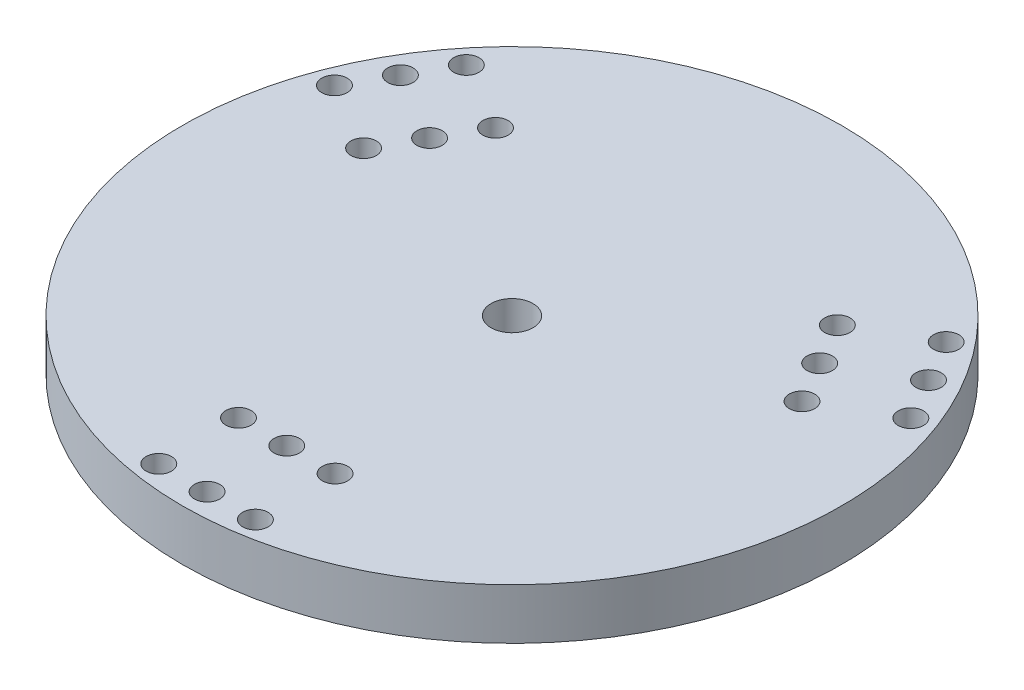
ISO-10303-21;
HEADER;
FILE_DESCRIPTION(('STEP AP214'),'2;1');
FILE_NAME('part.step','',(''),(''),'','','');
FILE_SCHEMA(('AUTOMOTIVE_DESIGN { 1 0 10303 214 1 1 1 1 }'));
ENDSEC;
DATA;
#1=APPLICATION_CONTEXT('core data for automotive mechanical design processes');
#2=APPLICATION_PROTOCOL_DEFINITION('international standard','automotive_design',2000,#1);
#3=PRODUCT_CONTEXT('',#1,'mechanical');
#4=PRODUCT('Part','Part','',(#3));
#5=PRODUCT_RELATED_PRODUCT_CATEGORY('part','',(#4));
#6=PRODUCT_DEFINITION_FORMATION('','',#4);
#7=PRODUCT_DEFINITION_CONTEXT('part definition',#1,'design');
#8=PRODUCT_DEFINITION('design','',#6,#7);
#9=PRODUCT_DEFINITION_SHAPE('','',#8);
#10=(LENGTH_UNIT() NAMED_UNIT(*) SI_UNIT(.MILLI.,.METRE.));
#11=(NAMED_UNIT(*) PLANE_ANGLE_UNIT() SI_UNIT($,.RADIAN.));
#12=(NAMED_UNIT(*) SI_UNIT($,.STERADIAN.) SOLID_ANGLE_UNIT());
#13=UNCERTAINTY_MEASURE_WITH_UNIT(LENGTH_MEASURE(1.E-05),#10,'distance_accuracy_value','');
#14=(GEOMETRIC_REPRESENTATION_CONTEXT(3) GLOBAL_UNCERTAINTY_ASSIGNED_CONTEXT((#13)) GLOBAL_UNIT_ASSIGNED_CONTEXT((#10,
#11,#12)) REPRESENTATION_CONTEXT('',''));
#15=CARTESIAN_POINT('',(0.,0.,0.));
#16=DIRECTION('',(0.,0.,1.));
#17=DIRECTION('',(1.,0.,0.));
#18=AXIS2_PLACEMENT_3D('',#15,#16,#17);
#19=CARTESIAN_POINT('',(0.,65.,0.));
#20=DIRECTION('',(0.,1.,0.));
#21=DIRECTION('',(0.,0.,1.));
#22=AXIS2_PLACEMENT_3D('',#19,#20,#21);
#23=CYLINDRICAL_SURFACE('',#22,64.85);
#24=CARTESIAN_POINT('',(0.,65.,0.));
#25=DIRECTION('',(0.,1.,0.));
#26=DIRECTION('',(0.,0.,1.));
#27=AXIS2_PLACEMENT_3D('',#24,#25,#26);
#28=CIRCLE('',#27,64.85);
#29=CARTESIAN_POINT('',(0.,65.,64.85));
#30=VERTEX_POINT('',#29);
#31=EDGE_CURVE('E50',#30,#30,#28,.F.);
#32=ORIENTED_EDGE('',*,*,#31,.F.);
#33=EDGE_LOOP('',(#32));
#34=FACE_BOUND('',#33,.T.);
#35=CARTESIAN_POINT('',(0.,75.,0.));
#36=DIRECTION('',(0.,1.,0.));
#37=DIRECTION('',(0.,0.,1.));
#38=AXIS2_PLACEMENT_3D('',#35,#36,#37);
#39=CIRCLE('',#38,64.85);
#40=CARTESIAN_POINT('',(0.,75.,64.85));
#41=VERTEX_POINT('',#40);
#42=EDGE_CURVE('E131',#41,#41,#39,.F.);
#43=ORIENTED_EDGE('',*,*,#42,.T.);
#44=EDGE_LOOP('',(#43));
#45=FACE_BOUND('',#44,.T.);
#46=ADVANCED_FACE('F41',(#34,#45),#23,.T.);
#47=CARTESIAN_POINT('',(-33.6322458957263,65.,-30.3872413359521));
#48=DIRECTION('',(0.,1.,0.));
#49=DIRECTION('',(0.,0.,1.));
#50=AXIS2_PLACEMENT_3D('',#47,#48,#49);
#51=CYLINDRICAL_SURFACE('',#50,2.5);
#52=CARTESIAN_POINT('',(-33.6322458957263,65.,-30.3872413359521));
#53=DIRECTION('',(0.,1.,0.));
#54=DIRECTION('',(0.,0.,1.));
#55=AXIS2_PLACEMENT_3D('',#52,#53,#54);
#56=CIRCLE('',#55,2.5);
#57=CARTESIAN_POINT('',(-33.6322458957263,65.,-27.8872413359521));
#58=VERTEX_POINT('',#57);
#59=EDGE_CURVE('E56',#58,#58,#56,.F.);
#60=ORIENTED_EDGE('',*,*,#59,.T.);
#61=EDGE_LOOP('',(#60));
#62=FACE_BOUND('',#61,.T.);
#63=CARTESIAN_POINT('',(-33.6322458957263,75.,-30.3872413359521));
#64=DIRECTION('',(0.,1.,0.));
#65=DIRECTION('',(0.,0.,1.));
#66=AXIS2_PLACEMENT_3D('',#63,#64,#65);
#67=CIRCLE('',#66,2.5);
#68=CARTESIAN_POINT('',(-33.6322458957263,75.,-27.8872413359521));
#69=VERTEX_POINT('',#68);
#70=EDGE_CURVE('E128',#69,#69,#67,.F.);
#71=ORIENTED_EDGE('',*,*,#70,.F.);
#72=EDGE_LOOP('',(#71));
#73=FACE_BOUND('',#72,.T.);
#74=ADVANCED_FACE('F214',(#62,#73),#51,.F.);
#75=CARTESIAN_POINT('',(-47.2115242270664,65.,-38.2272413359521));
#76=DIRECTION('',(0.,1.,0.));
#77=DIRECTION('',(0.,0.,1.));
#78=AXIS2_PLACEMENT_3D('',#75,#76,#77);
#79=CYLINDRICAL_SURFACE('',#78,2.5);
#80=CARTESIAN_POINT('',(-47.2115242270664,65.,-38.2272413359521));
#81=DIRECTION('',(0.,1.,0.));
#82=DIRECTION('',(0.,0.,1.));
#83=AXIS2_PLACEMENT_3D('',#80,#81,#82);
#84=CIRCLE('',#83,2.5);
#85=CARTESIAN_POINT('',(-47.2115242270664,65.,-35.7272413359521));
#86=VERTEX_POINT('',#85);
#87=EDGE_CURVE('E207',#86,#86,#84,.F.);
#88=ORIENTED_EDGE('',*,*,#87,.T.);
#89=EDGE_LOOP('',(#88));
#90=FACE_BOUND('',#89,.T.);
#91=CARTESIAN_POINT('',(-47.2115242270664,75.,-38.2272413359521));
#92=DIRECTION('',(0.,1.,0.));
#93=DIRECTION('',(0.,0.,1.));
#94=AXIS2_PLACEMENT_3D('',#91,#92,#93);
#95=CIRCLE('',#94,2.5);
#96=CARTESIAN_POINT('',(-47.2115242270664,75.,-35.7272413359521));
#97=VERTEX_POINT('',#96);
#98=EDGE_CURVE('E124',#97,#97,#95,.F.);
#99=ORIENTED_EDGE('',*,*,#98,.F.);
#100=EDGE_LOOP('',(#99));
#101=FACE_BOUND('',#100,.T.);
#102=ADVANCED_FACE('F232',(#90,#101),#79,.F.);
#103=CARTESIAN_POINT('',(-9.49999999999995,65.,44.32));
#104=DIRECTION('',(0.,1.,0.));
#105=DIRECTION('',(0.,0.,1.));
#106=AXIS2_PLACEMENT_3D('',#103,#104,#105);
#107=CYLINDRICAL_SURFACE('',#106,2.5);
#108=CARTESIAN_POINT('',(-9.49999999999995,65.,44.32));
#109=DIRECTION('',(0.,1.,0.));
#110=DIRECTION('',(0.,0.,1.));
#111=AXIS2_PLACEMENT_3D('',#108,#109,#110);
#112=CIRCLE('',#111,2.5);
#113=CARTESIAN_POINT('',(-9.49999999999995,65.,46.82));
#114=VERTEX_POINT('',#113);
#115=EDGE_CURVE('E203',#114,#114,#112,.F.);
#116=ORIENTED_EDGE('',*,*,#115,.T.);
#117=EDGE_LOOP('',(#116));
#118=FACE_BOUND('',#117,.T.);
#119=CARTESIAN_POINT('',(-9.49999999999995,75.,44.32));
#120=DIRECTION('',(0.,1.,0.));
#121=DIRECTION('',(0.,0.,1.));
#122=AXIS2_PLACEMENT_3D('',#119,#120,#121);
#123=CIRCLE('',#122,2.5);
#124=CARTESIAN_POINT('',(-9.49999999999995,75.,46.82));
#125=VERTEX_POINT('',#124);
#126=EDGE_CURVE('E120',#125,#125,#123,.F.);
#127=ORIENTED_EDGE('',*,*,#126,.F.);
#128=EDGE_LOOP('',(#127));
#129=FACE_BOUND('',#128,.T.);
#130=ADVANCED_FACE('F239',(#118,#129),#107,.F.);
#131=CARTESIAN_POINT('',(-9.49999999999995,65.,60.));
#132=DIRECTION('',(0.,1.,0.));
#133=DIRECTION('',(0.,0.,1.));
#134=AXIS2_PLACEMENT_3D('',#131,#132,#133);
#135=CYLINDRICAL_SURFACE('',#134,2.5);
#136=CARTESIAN_POINT('',(-9.49999999999995,65.,60.));
#137=DIRECTION('',(0.,1.,0.));
#138=DIRECTION('',(0.,0.,1.));
#139=AXIS2_PLACEMENT_3D('',#136,#137,#138);
#140=CIRCLE('',#139,2.5);
#141=CARTESIAN_POINT('',(-9.49999999999995,65.,62.5));
#142=VERTEX_POINT('',#141);
#143=EDGE_CURVE('E199',#142,#142,#140,.F.);
#144=ORIENTED_EDGE('',*,*,#143,.T.);
#145=EDGE_LOOP('',(#144));
#146=FACE_BOUND('',#145,.T.);
#147=CARTESIAN_POINT('',(-9.49999999999995,75.,60.));
#148=DIRECTION('',(0.,1.,0.));
#149=DIRECTION('',(0.,0.,1.));
#150=AXIS2_PLACEMENT_3D('',#147,#148,#149);
#151=CIRCLE('',#150,2.5);
#152=CARTESIAN_POINT('',(-9.49999999999995,75.,62.5));
#153=VERTEX_POINT('',#152);
#154=EDGE_CURVE('E116',#153,#153,#151,.F.);
#155=ORIENTED_EDGE('',*,*,#154,.F.);
#156=EDGE_LOOP('',(#155));
#157=FACE_BOUND('',#156,.T.);
#158=ADVANCED_FACE('F243',(#146,#157),#135,.F.);
#159=CARTESIAN_POINT('',(43.1322458957263,65.,-13.9327586640478));
#160=DIRECTION('',(0.,1.,0.));
#161=DIRECTION('',(0.,0.,1.));
#162=AXIS2_PLACEMENT_3D('',#159,#160,#161);
#163=CYLINDRICAL_SURFACE('',#162,2.49999999999999);
#164=CARTESIAN_POINT('',(43.1322458957263,65.,-13.9327586640478));
#165=DIRECTION('',(0.,1.,0.));
#166=DIRECTION('',(0.,0.,1.));
#167=AXIS2_PLACEMENT_3D('',#164,#165,#166);
#168=CIRCLE('',#167,2.49999999999999);
#169=CARTESIAN_POINT('',(43.1322458957263,65.,-11.4327586640478));
#170=VERTEX_POINT('',#169);
#171=EDGE_CURVE('E195',#170,#170,#168,.F.);
#172=ORIENTED_EDGE('',*,*,#171,.T.);
#173=EDGE_LOOP('',(#172));
#174=FACE_BOUND('',#173,.T.);
#175=CARTESIAN_POINT('',(43.1322458957263,75.,-13.9327586640478));
#176=DIRECTION('',(0.,1.,0.));
#177=DIRECTION('',(0.,0.,1.));
#178=AXIS2_PLACEMENT_3D('',#175,#176,#177);
#179=CIRCLE('',#178,2.49999999999999);
#180=CARTESIAN_POINT('',(43.1322458957263,75.,-11.4327586640478));
#181=VERTEX_POINT('',#180);
#182=EDGE_CURVE('E112',#181,#181,#179,.F.);
#183=ORIENTED_EDGE('',*,*,#182,.F.);
#184=EDGE_LOOP('',(#183));
#185=FACE_BOUND('',#184,.T.);
#186=ADVANCED_FACE('F247',(#174,#185),#163,.F.);
#187=CARTESIAN_POINT('',(56.7115242270663,65.,-21.7727586640479));
#188=DIRECTION('',(0.,1.,0.));
#189=DIRECTION('',(0.,0.,1.));
#190=AXIS2_PLACEMENT_3D('',#187,#188,#189);
#191=CYLINDRICAL_SURFACE('',#190,2.5);
#192=CARTESIAN_POINT('',(56.7115242270663,65.,-21.7727586640479));
#193=DIRECTION('',(0.,1.,0.));
#194=DIRECTION('',(0.,0.,1.));
#195=AXIS2_PLACEMENT_3D('',#192,#193,#194);
#196=CIRCLE('',#195,2.5);
#197=CARTESIAN_POINT('',(56.7115242270663,65.,-19.2727586640479));
#198=VERTEX_POINT('',#197);
#199=EDGE_CURVE('E191',#198,#198,#196,.F.);
#200=ORIENTED_EDGE('',*,*,#199,.T.);
#201=EDGE_LOOP('',(#200));
#202=FACE_BOUND('',#201,.T.);
#203=CARTESIAN_POINT('',(56.7115242270663,75.,-21.7727586640479));
#204=DIRECTION('',(0.,1.,0.));
#205=DIRECTION('',(0.,0.,1.));
#206=AXIS2_PLACEMENT_3D('',#203,#204,#205);
#207=CIRCLE('',#206,2.5);
#208=CARTESIAN_POINT('',(56.7115242270663,75.,-19.2727586640479));
#209=VERTEX_POINT('',#208);
#210=EDGE_CURVE('E108',#209,#209,#207,.F.);
#211=ORIENTED_EDGE('',*,*,#210,.F.);
#212=EDGE_LOOP('',(#211));
#213=FACE_BOUND('',#212,.T.);
#214=ADVANCED_FACE('F251',(#202,#213),#191,.F.);
#215=CARTESIAN_POINT('',(-43.1322458957264,65.,-13.9327586640478));
#216=DIRECTION('',(0.,1.,0.));
#217=DIRECTION('',(0.,0.,1.));
#218=AXIS2_PLACEMENT_3D('',#215,#216,#217);
#219=CYLINDRICAL_SURFACE('',#218,2.5);
#220=CARTESIAN_POINT('',(-43.1322458957264,65.,-13.9327586640478));
#221=DIRECTION('',(0.,1.,0.));
#222=DIRECTION('',(0.,0.,1.));
#223=AXIS2_PLACEMENT_3D('',#220,#221,#222);
#224=CIRCLE('',#223,2.5);
#225=CARTESIAN_POINT('',(-43.1322458957264,65.,-11.4327586640478));
#226=VERTEX_POINT('',#225);
#227=EDGE_CURVE('E187',#226,#226,#224,.F.);
#228=ORIENTED_EDGE('',*,*,#227,.T.);
#229=EDGE_LOOP('',(#228));
#230=FACE_BOUND('',#229,.T.);
#231=CARTESIAN_POINT('',(-43.1322458957264,75.,-13.9327586640478));
#232=DIRECTION('',(0.,1.,0.));
#233=DIRECTION('',(0.,0.,1.));
#234=AXIS2_PLACEMENT_3D('',#231,#232,#233);
#235=CIRCLE('',#234,2.5);
#236=CARTESIAN_POINT('',(-43.1322458957264,75.,-11.4327586640478));
#237=VERTEX_POINT('',#236);
#238=EDGE_CURVE('E104',#237,#237,#235,.F.);
#239=ORIENTED_EDGE('',*,*,#238,.F.);
#240=EDGE_LOOP('',(#239));
#241=FACE_BOUND('',#240,.T.);
#242=ADVANCED_FACE('F255',(#230,#241),#219,.F.);
#243=CARTESIAN_POINT('',(-38.3822458957263,65.,-22.16));
#244=DIRECTION('',(0.,1.,0.));
#245=DIRECTION('',(0.,0.,1.));
#246=AXIS2_PLACEMENT_3D('',#243,#244,#245);
#247=CYLINDRICAL_SURFACE('',#246,2.49999999999999);
#248=CARTESIAN_POINT('',(-38.3822458957263,65.,-22.16));
#249=DIRECTION('',(0.,1.,0.));
#250=DIRECTION('',(0.,0.,1.));
#251=AXIS2_PLACEMENT_3D('',#248,#249,#250);
#252=CIRCLE('',#251,2.49999999999999);
#253=CARTESIAN_POINT('',(-38.3822458957263,65.,-19.66));
#254=VERTEX_POINT('',#253);
#255=EDGE_CURVE('E183',#254,#254,#252,.F.);
#256=ORIENTED_EDGE('',*,*,#255,.T.);
#257=EDGE_LOOP('',(#256));
#258=FACE_BOUND('',#257,.T.);
#259=CARTESIAN_POINT('',(-38.3822458957263,75.,-22.16));
#260=DIRECTION('',(0.,1.,0.));
#261=DIRECTION('',(0.,0.,1.));
#262=AXIS2_PLACEMENT_3D('',#259,#260,#261);
#263=CIRCLE('',#262,2.49999999999999);
#264=CARTESIAN_POINT('',(-38.3822458957263,75.,-19.66));
#265=VERTEX_POINT('',#264);
#266=EDGE_CURVE('E100',#265,#265,#263,.F.);
#267=ORIENTED_EDGE('',*,*,#266,.F.);
#268=EDGE_LOOP('',(#267));
#269=FACE_BOUND('',#268,.T.);
#270=ADVANCED_FACE('F259',(#258,#269),#247,.F.);
#271=CARTESIAN_POINT('',(-51.9615242270664,65.,-30.));
#272=DIRECTION('',(0.,1.,0.));
#273=DIRECTION('',(0.,0.,1.));
#274=AXIS2_PLACEMENT_3D('',#271,#272,#273);
#275=CYLINDRICAL_SURFACE('',#274,2.5);
#276=CARTESIAN_POINT('',(-51.9615242270664,65.,-30.));
#277=DIRECTION('',(0.,1.,0.));
#278=DIRECTION('',(0.,0.,1.));
#279=AXIS2_PLACEMENT_3D('',#276,#277,#278);
#280=CIRCLE('',#279,2.5);
#281=CARTESIAN_POINT('',(-51.9615242270664,65.,-27.4999999999999));
#282=VERTEX_POINT('',#281);
#283=EDGE_CURVE('E179',#282,#282,#280,.F.);
#284=ORIENTED_EDGE('',*,*,#283,.T.);
#285=EDGE_LOOP('',(#284));
#286=FACE_BOUND('',#285,.T.);
#287=CARTESIAN_POINT('',(-51.9615242270664,75.,-30.));
#288=DIRECTION('',(0.,1.,0.));
#289=DIRECTION('',(0.,0.,1.));
#290=AXIS2_PLACEMENT_3D('',#287,#288,#289);
#291=CIRCLE('',#290,2.5);
#292=CARTESIAN_POINT('',(-51.9615242270664,75.,-27.4999999999999));
#293=VERTEX_POINT('',#292);
#294=EDGE_CURVE('E96',#293,#293,#291,.F.);
#295=ORIENTED_EDGE('',*,*,#294,.F.);
#296=EDGE_LOOP('',(#295));
#297=FACE_BOUND('',#296,.T.);
#298=ADVANCED_FACE('F263',(#286,#297),#275,.F.);
#299=CARTESIAN_POINT('',(-56.7115242270664,65.,-21.7727586640478));
#300=DIRECTION('',(0.,1.,0.));
#301=DIRECTION('',(0.,0.,1.));
#302=AXIS2_PLACEMENT_3D('',#299,#300,#301);
#303=CYLINDRICAL_SURFACE('',#302,2.5);
#304=CARTESIAN_POINT('',(-56.7115242270664,65.,-21.7727586640478));
#305=DIRECTION('',(0.,1.,0.));
#306=DIRECTION('',(0.,0.,1.));
#307=AXIS2_PLACEMENT_3D('',#304,#305,#306);
#308=CIRCLE('',#307,2.5);
#309=CARTESIAN_POINT('',(-56.7115242270664,65.,-19.2727586640478));
#310=VERTEX_POINT('',#309);
#311=EDGE_CURVE('E175',#310,#310,#308,.F.);
#312=ORIENTED_EDGE('',*,*,#311,.T.);
#313=EDGE_LOOP('',(#312));
#314=FACE_BOUND('',#313,.T.);
#315=CARTESIAN_POINT('',(-56.7115242270664,75.,-21.7727586640478));
#316=DIRECTION('',(0.,1.,0.));
#317=DIRECTION('',(0.,0.,1.));
#318=AXIS2_PLACEMENT_3D('',#315,#316,#317);
#319=CIRCLE('',#318,2.5);
#320=CARTESIAN_POINT('',(-56.7115242270664,75.,-19.2727586640478));
#321=VERTEX_POINT('',#320);
#322=EDGE_CURVE('E92',#321,#321,#319,.F.);
#323=ORIENTED_EDGE('',*,*,#322,.F.);
#324=EDGE_LOOP('',(#323));
#325=FACE_BOUND('',#324,.T.);
#326=ADVANCED_FACE('F267',(#314,#325),#303,.F.);
#327=CARTESIAN_POINT('',(9.50000000000004,65.,44.32));
#328=DIRECTION('',(0.,1.,0.));
#329=DIRECTION('',(0.,0.,1.));
#330=AXIS2_PLACEMENT_3D('',#327,#328,#329);
#331=CYLINDRICAL_SURFACE('',#330,2.5);
#332=CARTESIAN_POINT('',(9.50000000000004,65.,44.32));
#333=DIRECTION('',(0.,1.,0.));
#334=DIRECTION('',(0.,0.,1.));
#335=AXIS2_PLACEMENT_3D('',#332,#333,#334);
#336=CIRCLE('',#335,2.5);
#337=CARTESIAN_POINT('',(9.50000000000004,65.,46.82));
#338=VERTEX_POINT('',#337);
#339=EDGE_CURVE('E171',#338,#338,#336,.F.);
#340=ORIENTED_EDGE('',*,*,#339,.T.);
#341=EDGE_LOOP('',(#340));
#342=FACE_BOUND('',#341,.T.);
#343=CARTESIAN_POINT('',(9.50000000000004,75.,44.32));
#344=DIRECTION('',(0.,1.,0.));
#345=DIRECTION('',(0.,0.,1.));
#346=AXIS2_PLACEMENT_3D('',#343,#344,#345);
#347=CIRCLE('',#346,2.5);
#348=CARTESIAN_POINT('',(9.50000000000004,75.,46.82));
#349=VERTEX_POINT('',#348);
#350=EDGE_CURVE('E88',#349,#349,#347,.F.);
#351=ORIENTED_EDGE('',*,*,#350,.F.);
#352=EDGE_LOOP('',(#351));
#353=FACE_BOUND('',#352,.T.);
#354=ADVANCED_FACE('F271',(#342,#353),#331,.F.);
#355=CARTESIAN_POINT('',(0.,65.,44.32));
#356=DIRECTION('',(0.,1.,0.));
#357=DIRECTION('',(0.,0.,1.));
#358=AXIS2_PLACEMENT_3D('',#355,#356,#357);
#359=CYLINDRICAL_SURFACE('',#358,2.5);
#360=CARTESIAN_POINT('',(0.,65.,44.32));
#361=DIRECTION('',(0.,1.,0.));
#362=DIRECTION('',(0.,0.,1.));
#363=AXIS2_PLACEMENT_3D('',#360,#361,#362);
#364=CIRCLE('',#363,2.5);
#365=CARTESIAN_POINT('',(0.,65.,46.82));
#366=VERTEX_POINT('',#365);
#367=EDGE_CURVE('E167',#366,#366,#364,.F.);
#368=ORIENTED_EDGE('',*,*,#367,.T.);
#369=EDGE_LOOP('',(#368));
#370=FACE_BOUND('',#369,.T.);
#371=CARTESIAN_POINT('',(0.,75.,44.32));
#372=DIRECTION('',(0.,1.,0.));
#373=DIRECTION('',(0.,0.,1.));
#374=AXIS2_PLACEMENT_3D('',#371,#372,#373);
#375=CIRCLE('',#374,2.5);
#376=CARTESIAN_POINT('',(0.,75.,46.82));
#377=VERTEX_POINT('',#376);
#378=EDGE_CURVE('E84',#377,#377,#375,.F.);
#379=ORIENTED_EDGE('',*,*,#378,.F.);
#380=EDGE_LOOP('',(#379));
#381=FACE_BOUND('',#380,.T.);
#382=ADVANCED_FACE('F275',(#370,#381),#359,.F.);
#383=CARTESIAN_POINT('',(0.,65.,60.));
#384=DIRECTION('',(0.,1.,0.));
#385=DIRECTION('',(0.,0.,1.));
#386=AXIS2_PLACEMENT_3D('',#383,#384,#385);
#387=CYLINDRICAL_SURFACE('',#386,2.5);
#388=CARTESIAN_POINT('',(0.,65.,60.));
#389=DIRECTION('',(0.,1.,0.));
#390=DIRECTION('',(0.,0.,1.));
#391=AXIS2_PLACEMENT_3D('',#388,#389,#390);
#392=CIRCLE('',#391,2.5);
#393=CARTESIAN_POINT('',(0.,65.,62.5));
#394=VERTEX_POINT('',#393);
#395=EDGE_CURVE('E163',#394,#394,#392,.F.);
#396=ORIENTED_EDGE('',*,*,#395,.T.);
#397=EDGE_LOOP('',(#396));
#398=FACE_BOUND('',#397,.T.);
#399=CARTESIAN_POINT('',(0.,75.,60.));
#400=DIRECTION('',(0.,1.,0.));
#401=DIRECTION('',(0.,0.,1.));
#402=AXIS2_PLACEMENT_3D('',#399,#400,#401);
#403=CIRCLE('',#402,2.5);
#404=CARTESIAN_POINT('',(0.,75.,62.5));
#405=VERTEX_POINT('',#404);
#406=EDGE_CURVE('E80',#405,#405,#403,.F.);
#407=ORIENTED_EDGE('',*,*,#406,.F.);
#408=EDGE_LOOP('',(#407));
#409=FACE_BOUND('',#408,.T.);
#410=ADVANCED_FACE('F279',(#398,#409),#387,.F.);
#411=CARTESIAN_POINT('',(9.50000000000007,65.,60.0000000000001));
#412=DIRECTION('',(0.,1.,0.));
#413=DIRECTION('',(0.,0.,1.));
#414=AXIS2_PLACEMENT_3D('',#411,#412,#413);
#415=CYLINDRICAL_SURFACE('',#414,2.50000000000001);
#416=CARTESIAN_POINT('',(9.50000000000007,65.,60.0000000000001));
#417=DIRECTION('',(0.,1.,0.));
#418=DIRECTION('',(0.,0.,1.));
#419=AXIS2_PLACEMENT_3D('',#416,#417,#418);
#420=CIRCLE('',#419,2.50000000000001);
#421=CARTESIAN_POINT('',(9.50000000000007,65.,62.5000000000001));
#422=VERTEX_POINT('',#421);
#423=EDGE_CURVE('E159',#422,#422,#420,.F.);
#424=ORIENTED_EDGE('',*,*,#423,.T.);
#425=EDGE_LOOP('',(#424));
#426=FACE_BOUND('',#425,.T.);
#427=CARTESIAN_POINT('',(9.50000000000007,75.,60.0000000000001));
#428=DIRECTION('',(0.,1.,0.));
#429=DIRECTION('',(0.,0.,1.));
#430=AXIS2_PLACEMENT_3D('',#427,#428,#429);
#431=CIRCLE('',#430,2.50000000000001);
#432=CARTESIAN_POINT('',(9.50000000000007,75.,62.5000000000001));
#433=VERTEX_POINT('',#432);
#434=EDGE_CURVE('E76',#433,#433,#431,.F.);
#435=ORIENTED_EDGE('',*,*,#434,.F.);
#436=EDGE_LOOP('',(#435));
#437=FACE_BOUND('',#436,.T.);
#438=ADVANCED_FACE('F283',(#426,#437),#415,.F.);
#439=CARTESIAN_POINT('',(33.6322458957263,65.,-30.3872413359522));
#440=DIRECTION('',(0.,1.,0.));
#441=DIRECTION('',(0.,0.,1.));
#442=AXIS2_PLACEMENT_3D('',#439,#440,#441);
#443=CYLINDRICAL_SURFACE('',#442,2.5);
#444=CARTESIAN_POINT('',(33.6322458957263,65.,-30.3872413359522));
#445=DIRECTION('',(0.,1.,0.));
#446=DIRECTION('',(0.,0.,1.));
#447=AXIS2_PLACEMENT_3D('',#444,#445,#446);
#448=CIRCLE('',#447,2.5);
#449=CARTESIAN_POINT('',(33.6322458957263,65.,-27.8872413359522));
#450=VERTEX_POINT('',#449);
#451=EDGE_CURVE('E155',#450,#450,#448,.F.);
#452=ORIENTED_EDGE('',*,*,#451,.T.);
#453=EDGE_LOOP('',(#452));
#454=FACE_BOUND('',#453,.T.);
#455=CARTESIAN_POINT('',(33.6322458957263,75.,-30.3872413359522));
#456=DIRECTION('',(0.,1.,0.));
#457=DIRECTION('',(0.,0.,1.));
#458=AXIS2_PLACEMENT_3D('',#455,#456,#457);
#459=CIRCLE('',#458,2.5);
#460=CARTESIAN_POINT('',(33.6322458957263,75.,-27.8872413359522));
#461=VERTEX_POINT('',#460);
#462=EDGE_CURVE('E72',#461,#461,#459,.F.);
#463=ORIENTED_EDGE('',*,*,#462,.F.);
#464=EDGE_LOOP('',(#463));
#465=FACE_BOUND('',#464,.T.);
#466=ADVANCED_FACE('F287',(#454,#465),#443,.F.);
#467=CARTESIAN_POINT('',(38.3822458957263,65.,-22.1600000000001));
#468=DIRECTION('',(0.,1.,0.));
#469=DIRECTION('',(0.,0.,1.));
#470=AXIS2_PLACEMENT_3D('',#467,#468,#469);
#471=CYLINDRICAL_SURFACE('',#470,2.49999999999999);
#472=CARTESIAN_POINT('',(38.3822458957263,65.,-22.1600000000001));
#473=DIRECTION('',(0.,1.,0.));
#474=DIRECTION('',(0.,0.,1.));
#475=AXIS2_PLACEMENT_3D('',#472,#473,#474);
#476=CIRCLE('',#475,2.49999999999999);
#477=CARTESIAN_POINT('',(38.3822458957263,65.,-19.6600000000001));
#478=VERTEX_POINT('',#477);
#479=EDGE_CURVE('E149',#478,#478,#476,.F.);
#480=ORIENTED_EDGE('',*,*,#479,.T.);
#481=EDGE_LOOP('',(#480));
#482=FACE_BOUND('',#481,.T.);
#483=CARTESIAN_POINT('',(38.3822458957263,75.,-22.1600000000001));
#484=DIRECTION('',(0.,1.,0.));
#485=DIRECTION('',(0.,0.,1.));
#486=AXIS2_PLACEMENT_3D('',#483,#484,#485);
#487=CIRCLE('',#486,2.49999999999999);
#488=CARTESIAN_POINT('',(38.3822458957263,75.,-19.6600000000001));
#489=VERTEX_POINT('',#488);
#490=EDGE_CURVE('E68',#489,#489,#487,.F.);
#491=ORIENTED_EDGE('',*,*,#490,.F.);
#492=EDGE_LOOP('',(#491));
#493=FACE_BOUND('',#492,.T.);
#494=ADVANCED_FACE('F291',(#482,#493),#471,.F.);
#495=CARTESIAN_POINT('',(51.9615242270663,65.,-30.0000000000001));
#496=DIRECTION('',(0.,1.,0.));
#497=DIRECTION('',(0.,0.,1.));
#498=AXIS2_PLACEMENT_3D('',#495,#496,#497);
#499=CYLINDRICAL_SURFACE('',#498,2.5);
#500=CARTESIAN_POINT('',(51.9615242270663,65.,-30.0000000000001));
#501=DIRECTION('',(0.,1.,0.));
#502=DIRECTION('',(0.,0.,1.));
#503=AXIS2_PLACEMENT_3D('',#500,#501,#502);
#504=CIRCLE('',#503,2.5);
#505=CARTESIAN_POINT('',(51.9615242270663,65.,-27.5000000000001));
#506=VERTEX_POINT('',#505);
#507=EDGE_CURVE('E143',#506,#506,#504,.F.);
#508=ORIENTED_EDGE('',*,*,#507,.T.);
#509=EDGE_LOOP('',(#508));
#510=FACE_BOUND('',#509,.T.);
#511=CARTESIAN_POINT('',(51.9615242270663,75.,-30.0000000000001));
#512=DIRECTION('',(0.,1.,0.));
#513=DIRECTION('',(0.,0.,1.));
#514=AXIS2_PLACEMENT_3D('',#511,#512,#513);
#515=CIRCLE('',#514,2.5);
#516=CARTESIAN_POINT('',(51.9615242270663,75.,-27.5000000000001));
#517=VERTEX_POINT('',#516);
#518=EDGE_CURVE('E64',#517,#517,#515,.F.);
#519=ORIENTED_EDGE('',*,*,#518,.F.);
#520=EDGE_LOOP('',(#519));
#521=FACE_BOUND('',#520,.T.);
#522=ADVANCED_FACE('F294',(#510,#521),#499,.F.);
#523=CARTESIAN_POINT('',(47.2115242270664,65.,-38.2272413359522));
#524=DIRECTION('',(0.,1.,0.));
#525=DIRECTION('',(0.,0.,1.));
#526=AXIS2_PLACEMENT_3D('',#523,#524,#525);
#527=CYLINDRICAL_SURFACE('',#526,2.5);
#528=CARTESIAN_POINT('',(47.2115242270664,65.,-38.2272413359522));
#529=DIRECTION('',(0.,1.,0.));
#530=DIRECTION('',(0.,0.,1.));
#531=AXIS2_PLACEMENT_3D('',#528,#529,#530);
#532=CIRCLE('',#531,2.5);
#533=CARTESIAN_POINT('',(47.2115242270664,65.,-35.7272413359522));
#534=VERTEX_POINT('',#533);
#535=EDGE_CURVE('E138',#534,#534,#532,.F.);
#536=ORIENTED_EDGE('',*,*,#535,.T.);
#537=EDGE_LOOP('',(#536));
#538=FACE_BOUND('',#537,.T.);
#539=CARTESIAN_POINT('',(47.2115242270664,75.,-38.2272413359522));
#540=DIRECTION('',(0.,1.,0.));
#541=DIRECTION('',(0.,0.,1.));
#542=AXIS2_PLACEMENT_3D('',#539,#540,#541);
#543=CIRCLE('',#542,2.5);
#544=CARTESIAN_POINT('',(47.2115242270664,75.,-35.7272413359522));
#545=VERTEX_POINT('',#544);
#546=EDGE_CURVE('E60',#545,#545,#543,.F.);
#547=ORIENTED_EDGE('',*,*,#546,.F.);
#548=EDGE_LOOP('',(#547));
#549=FACE_BOUND('',#548,.T.);
#550=ADVANCED_FACE('F43',(#538,#549),#527,.F.);
#551=CARTESIAN_POINT('',(0.,65.,0.));
#552=DIRECTION('',(0.,1.,0.));
#553=DIRECTION('',(0.,0.,1.));
#554=AXIS2_PLACEMENT_3D('',#551,#552,#553);
#555=CYLINDRICAL_SURFACE('',#554,4.1275);
#556=CARTESIAN_POINT('',(0.,65.,0.));
#557=DIRECTION('',(0.,1.,0.));
#558=DIRECTION('',(0.,0.,1.));
#559=AXIS2_PLACEMENT_3D('',#556,#557,#558);
#560=CIRCLE('',#559,4.1275);
#561=CARTESIAN_POINT('',(0.,65.,4.1275));
#562=VERTEX_POINT('',#561);
#563=EDGE_CURVE('E10',#562,#562,#560,.F.);
#564=ORIENTED_EDGE('',*,*,#563,.T.);
#565=EDGE_LOOP('',(#564));
#566=FACE_BOUND('',#565,.T.);
#567=CARTESIAN_POINT('',(0.,75.,0.));
#568=DIRECTION('',(0.,1.,0.));
#569=DIRECTION('',(0.,0.,1.));
#570=AXIS2_PLACEMENT_3D('',#567,#568,#569);
#571=CIRCLE('',#570,4.1275);
#572=CARTESIAN_POINT('',(0.,75.,4.1275));
#573=VERTEX_POINT('',#572);
#574=EDGE_CURVE('E45',#573,#573,#571,.F.);
#575=ORIENTED_EDGE('',*,*,#574,.F.);
#576=EDGE_LOOP('',(#575));
#577=FACE_BOUND('',#576,.T.);
#578=ADVANCED_FACE('F221',(#566,#577),#555,.F.);
#579=CARTESIAN_POINT('',(0.,65.,0.));
#580=DIRECTION('',(0.,1.,0.));
#581=DIRECTION('',(0.,0.,1.));
#582=AXIS2_PLACEMENT_3D('',#579,#580,#581);
#583=PLANE('',#582);
#584=ORIENTED_EDGE('',*,*,#535,.F.);
#585=EDGE_LOOP('',(#584));
#586=FACE_BOUND('',#585,.T.);
#587=ORIENTED_EDGE('',*,*,#507,.F.);
#588=EDGE_LOOP('',(#587));
#589=FACE_BOUND('',#588,.T.);
#590=ORIENTED_EDGE('',*,*,#479,.F.);
#591=EDGE_LOOP('',(#590));
#592=FACE_BOUND('',#591,.T.);
#593=ORIENTED_EDGE('',*,*,#451,.F.);
#594=EDGE_LOOP('',(#593));
#595=FACE_BOUND('',#594,.T.);
#596=ORIENTED_EDGE('',*,*,#423,.F.);
#597=EDGE_LOOP('',(#596));
#598=FACE_BOUND('',#597,.T.);
#599=ORIENTED_EDGE('',*,*,#395,.F.);
#600=EDGE_LOOP('',(#599));
#601=FACE_BOUND('',#600,.T.);
#602=ORIENTED_EDGE('',*,*,#367,.F.);
#603=EDGE_LOOP('',(#602));
#604=FACE_BOUND('',#603,.T.);
#605=ORIENTED_EDGE('',*,*,#339,.F.);
#606=EDGE_LOOP('',(#605));
#607=FACE_BOUND('',#606,.T.);
#608=ORIENTED_EDGE('',*,*,#311,.F.);
#609=EDGE_LOOP('',(#608));
#610=FACE_BOUND('',#609,.T.);
#611=ORIENTED_EDGE('',*,*,#283,.F.);
#612=EDGE_LOOP('',(#611));
#613=FACE_BOUND('',#612,.T.);
#614=ORIENTED_EDGE('',*,*,#255,.F.);
#615=EDGE_LOOP('',(#614));
#616=FACE_BOUND('',#615,.T.);
#617=ORIENTED_EDGE('',*,*,#227,.F.);
#618=EDGE_LOOP('',(#617));
#619=FACE_BOUND('',#618,.T.);
#620=ORIENTED_EDGE('',*,*,#199,.F.);
#621=EDGE_LOOP('',(#620));
#622=FACE_BOUND('',#621,.T.);
#623=ORIENTED_EDGE('',*,*,#171,.F.);
#624=EDGE_LOOP('',(#623));
#625=FACE_BOUND('',#624,.T.);
#626=ORIENTED_EDGE('',*,*,#143,.F.);
#627=EDGE_LOOP('',(#626));
#628=FACE_BOUND('',#627,.T.);
#629=ORIENTED_EDGE('',*,*,#115,.F.);
#630=EDGE_LOOP('',(#629));
#631=FACE_BOUND('',#630,.T.);
#632=ORIENTED_EDGE('',*,*,#87,.F.);
#633=EDGE_LOOP('',(#632));
#634=FACE_BOUND('',#633,.T.);
#635=ORIENTED_EDGE('',*,*,#59,.F.);
#636=EDGE_LOOP('',(#635));
#637=FACE_BOUND('',#636,.T.);
#638=ORIENTED_EDGE('',*,*,#31,.T.);
#639=EDGE_LOOP('',(#638));
#640=FACE_BOUND('',#639,.T.);
#641=ORIENTED_EDGE('',*,*,#563,.F.);
#642=EDGE_LOOP('',(#641));
#643=FACE_BOUND('',#642,.T.);
#644=ADVANCED_FACE('F217',(#586,#589,#592,#595,#598,#601,#604,#607,#610,#613,#616,#619,#622,
#625,#628,#631,#634,#637,#640,#643),#583,.F.);
#645=CARTESIAN_POINT('',(0.,75.,0.));
#646=DIRECTION('',(0.,1.,0.));
#647=DIRECTION('',(0.,0.,1.));
#648=AXIS2_PLACEMENT_3D('',#645,#646,#647);
#649=PLANE('',#648);
#650=ORIENTED_EDGE('',*,*,#546,.T.);
#651=EDGE_LOOP('',(#650));
#652=FACE_BOUND('',#651,.T.);
#653=ORIENTED_EDGE('',*,*,#518,.T.);
#654=EDGE_LOOP('',(#653));
#655=FACE_BOUND('',#654,.T.);
#656=ORIENTED_EDGE('',*,*,#490,.T.);
#657=EDGE_LOOP('',(#656));
#658=FACE_BOUND('',#657,.T.);
#659=ORIENTED_EDGE('',*,*,#462,.T.);
#660=EDGE_LOOP('',(#659));
#661=FACE_BOUND('',#660,.T.);
#662=ORIENTED_EDGE('',*,*,#434,.T.);
#663=EDGE_LOOP('',(#662));
#664=FACE_BOUND('',#663,.T.);
#665=ORIENTED_EDGE('',*,*,#406,.T.);
#666=EDGE_LOOP('',(#665));
#667=FACE_BOUND('',#666,.T.);
#668=ORIENTED_EDGE('',*,*,#378,.T.);
#669=EDGE_LOOP('',(#668));
#670=FACE_BOUND('',#669,.T.);
#671=ORIENTED_EDGE('',*,*,#350,.T.);
#672=EDGE_LOOP('',(#671));
#673=FACE_BOUND('',#672,.T.);
#674=ORIENTED_EDGE('',*,*,#322,.T.);
#675=EDGE_LOOP('',(#674));
#676=FACE_BOUND('',#675,.T.);
#677=ORIENTED_EDGE('',*,*,#294,.T.);
#678=EDGE_LOOP('',(#677));
#679=FACE_BOUND('',#678,.T.);
#680=ORIENTED_EDGE('',*,*,#266,.T.);
#681=EDGE_LOOP('',(#680));
#682=FACE_BOUND('',#681,.T.);
#683=ORIENTED_EDGE('',*,*,#238,.T.);
#684=EDGE_LOOP('',(#683));
#685=FACE_BOUND('',#684,.T.);
#686=ORIENTED_EDGE('',*,*,#210,.T.);
#687=EDGE_LOOP('',(#686));
#688=FACE_BOUND('',#687,.T.);
#689=ORIENTED_EDGE('',*,*,#182,.T.);
#690=EDGE_LOOP('',(#689));
#691=FACE_BOUND('',#690,.T.);
#692=ORIENTED_EDGE('',*,*,#154,.T.);
#693=EDGE_LOOP('',(#692));
#694=FACE_BOUND('',#693,.T.);
#695=ORIENTED_EDGE('',*,*,#126,.T.);
#696=EDGE_LOOP('',(#695));
#697=FACE_BOUND('',#696,.T.);
#698=ORIENTED_EDGE('',*,*,#98,.T.);
#699=EDGE_LOOP('',(#698));
#700=FACE_BOUND('',#699,.T.);
#701=ORIENTED_EDGE('',*,*,#70,.T.);
#702=EDGE_LOOP('',(#701));
#703=FACE_BOUND('',#702,.T.);
#704=ORIENTED_EDGE('',*,*,#42,.F.);
#705=EDGE_LOOP('',(#704));
#706=FACE_BOUND('',#705,.T.);
#707=ORIENTED_EDGE('',*,*,#574,.T.);
#708=EDGE_LOOP('',(#707));
#709=FACE_BOUND('',#708,.T.);
#710=ADVANCED_FACE('F220',(#652,#655,#658,#661,#664,#667,#670,#673,#676,#679,#682,#685,#688,
#691,#694,#697,#700,#703,#706,#709),#649,.T.);
#711=CLOSED_SHELL('',(#46,#74,#102,#130,#158,#186,#214,#242,#270,#298,#326,#354,#382,#410,#438,
#466,#494,#522,#550,#578,#644,#710));
#712=MANIFOLD_SOLID_BREP('B2',#711);
#713=ADVANCED_BREP_SHAPE_REPRESENTATION('',(#18,#712),#14);
#714=SHAPE_DEFINITION_REPRESENTATION(#9,#713);
ENDSEC;
END-ISO-10303-21;
